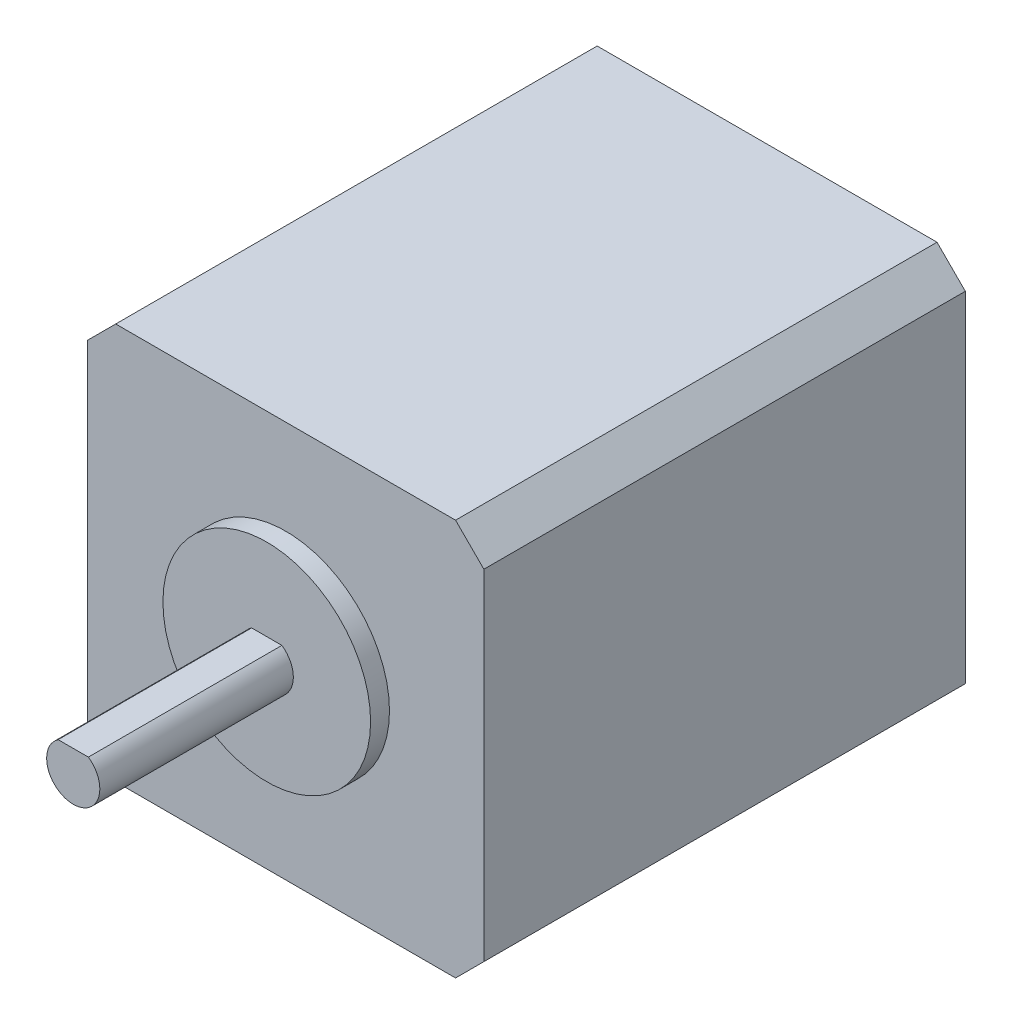
ISO-10303-21;
HEADER;
FILE_DESCRIPTION(('STEP AP214'),'2;1');
FILE_NAME('part.step','',(''),(''),'','','');
FILE_SCHEMA(('AUTOMOTIVE_DESIGN { 1 0 10303 214 1 1 1 1 }'));
ENDSEC;
DATA;
#1=APPLICATION_CONTEXT('core data for automotive mechanical design processes');
#2=APPLICATION_PROTOCOL_DEFINITION('international standard','automotive_design',2000,#1);
#3=PRODUCT_CONTEXT('',#1,'mechanical');
#4=PRODUCT('Part','Part','',(#3));
#5=PRODUCT_RELATED_PRODUCT_CATEGORY('part','',(#4));
#6=PRODUCT_DEFINITION_FORMATION('','',#4);
#7=PRODUCT_DEFINITION_CONTEXT('part definition',#1,'design');
#8=PRODUCT_DEFINITION('design','',#6,#7);
#9=PRODUCT_DEFINITION_SHAPE('','',#8);
#10=(LENGTH_UNIT() NAMED_UNIT(*) SI_UNIT(.MILLI.,.METRE.));
#11=(NAMED_UNIT(*) PLANE_ANGLE_UNIT() SI_UNIT($,.RADIAN.));
#12=(NAMED_UNIT(*) SI_UNIT($,.STERADIAN.) SOLID_ANGLE_UNIT());
#13=UNCERTAINTY_MEASURE_WITH_UNIT(LENGTH_MEASURE(1.E-05),#10,'distance_accuracy_value','');
#14=(GEOMETRIC_REPRESENTATION_CONTEXT(3) GLOBAL_UNCERTAINTY_ASSIGNED_CONTEXT((#13)) GLOBAL_UNIT_ASSIGNED_CONTEXT((#10,
#11,#12)) REPRESENTATION_CONTEXT('',''));
#15=CARTESIAN_POINT('',(0.,0.,0.));
#16=DIRECTION('',(0.,0.,1.));
#17=DIRECTION('',(1.,0.,0.));
#18=AXIS2_PLACEMENT_3D('',#15,#16,#17);
#19=CARTESIAN_POINT('',(21.,-21.,51.));
#20=DIRECTION('',(-1.,0.,0.));
#21=DIRECTION('',(0.,0.,1.));
#22=AXIS2_PLACEMENT_3D('',#19,#20,#21);
#23=PLANE('',#22);
#24=DIRECTION('',(0.,1.,0.));
#25=VECTOR('',#24,1.);
#26=CARTESIAN_POINT('',(21.,-21.,51.));
#27=LINE('',#26,#25);
#28=CARTESIAN_POINT('',(21.,-18.,51.));
#29=VERTEX_POINT('',#28);
#30=CARTESIAN_POINT('',(21.,18.,51.));
#31=VERTEX_POINT('',#30);
#32=EDGE_CURVE('E158',#29,#31,#27,.T.);
#33=ORIENTED_EDGE('',*,*,#32,.F.);
#34=DIRECTION('',(0.,0.,-1.));
#35=VECTOR('',#34,1.);
#36=CARTESIAN_POINT('',(21.,-18.,51.));
#37=LINE('',#36,#35);
#38=CARTESIAN_POINT('',(21.,-18.,0.));
#39=VERTEX_POINT('',#38);
#40=EDGE_CURVE('E178',#29,#39,#37,.T.);
#41=ORIENTED_EDGE('',*,*,#40,.T.);
#42=DIRECTION('',(0.,1.,0.));
#43=VECTOR('',#42,1.);
#44=CARTESIAN_POINT('',(21.,-21.,0.));
#45=LINE('',#44,#43);
#46=CARTESIAN_POINT('',(21.,18.,0.));
#47=VERTEX_POINT('',#46);
#48=EDGE_CURVE('E148',#39,#47,#45,.T.);
#49=ORIENTED_EDGE('',*,*,#48,.T.);
#50=DIRECTION('',(0.,0.,1.));
#51=VECTOR('',#50,1.);
#52=CARTESIAN_POINT('',(21.,18.,51.));
#53=LINE('',#52,#51);
#54=EDGE_CURVE('E156',#47,#31,#53,.T.);
#55=ORIENTED_EDGE('',*,*,#54,.T.);
#56=EDGE_LOOP('',(#33,#41,#49,#55));
#57=FACE_BOUND('',#56,.T.);
#58=ADVANCED_FACE('F47',(#57),#23,.F.);
#59=CARTESIAN_POINT('',(-21.,21.,51.));
#60=DIRECTION('',(0.,-1.,0.));
#61=DIRECTION('',(0.,0.,-1.));
#62=AXIS2_PLACEMENT_3D('',#59,#60,#61);
#63=PLANE('',#62);
#64=DIRECTION('',(-1.,0.,0.));
#65=VECTOR('',#64,1.);
#66=CARTESIAN_POINT('',(-21.,21.,0.));
#67=LINE('',#66,#65);
#68=CARTESIAN_POINT('',(18.,21.,0.));
#69=VERTEX_POINT('',#68);
#70=CARTESIAN_POINT('',(-18.,21.,0.));
#71=VERTEX_POINT('',#70);
#72=EDGE_CURVE('E170',#69,#71,#67,.T.);
#73=ORIENTED_EDGE('',*,*,#72,.T.);
#74=DIRECTION('',(0.,0.,1.));
#75=VECTOR('',#74,1.);
#76=CARTESIAN_POINT('',(-18.,21.,51.));
#77=LINE('',#76,#75);
#78=CARTESIAN_POINT('',(-18.,21.,51.));
#79=VERTEX_POINT('',#78);
#80=EDGE_CURVE('E11',#71,#79,#77,.T.);
#81=ORIENTED_EDGE('',*,*,#80,.T.);
#82=DIRECTION('',(-1.,0.,0.));
#83=VECTOR('',#82,1.);
#84=CARTESIAN_POINT('',(-21.,21.,51.));
#85=LINE('',#84,#83);
#86=CARTESIAN_POINT('',(18.,21.,51.));
#87=VERTEX_POINT('',#86);
#88=EDGE_CURVE('E161',#87,#79,#85,.T.);
#89=ORIENTED_EDGE('',*,*,#88,.F.);
#90=DIRECTION('',(0.,0.,-1.));
#91=VECTOR('',#90,1.);
#92=CARTESIAN_POINT('',(18.,21.,51.));
#93=LINE('',#92,#91);
#94=EDGE_CURVE('E56',#87,#69,#93,.T.);
#95=ORIENTED_EDGE('',*,*,#94,.T.);
#96=EDGE_LOOP('',(#73,#81,#89,#95));
#97=FACE_BOUND('',#96,.T.);
#98=ADVANCED_FACE('F209',(#97),#63,.F.);
#99=CARTESIAN_POINT('',(-21.,-21.,51.));
#100=DIRECTION('',(1.,0.,0.));
#101=DIRECTION('',(0.,0.,-1.));
#102=AXIS2_PLACEMENT_3D('',#99,#100,#101);
#103=PLANE('',#102);
#104=DIRECTION('',(0.,-1.,0.));
#105=VECTOR('',#104,1.);
#106=CARTESIAN_POINT('',(-21.,-21.,0.));
#107=LINE('',#106,#105);
#108=CARTESIAN_POINT('',(-21.,18.,0.));
#109=VERTEX_POINT('',#108);
#110=CARTESIAN_POINT('',(-21.,-18.,0.));
#111=VERTEX_POINT('',#110);
#112=EDGE_CURVE('E173',#109,#111,#107,.T.);
#113=ORIENTED_EDGE('',*,*,#112,.T.);
#114=DIRECTION('',(0.,0.,1.));
#115=VECTOR('',#114,1.);
#116=CARTESIAN_POINT('',(-21.,-18.,51.));
#117=LINE('',#116,#115);
#118=CARTESIAN_POINT('',(-21.,-18.,51.));
#119=VERTEX_POINT('',#118);
#120=EDGE_CURVE('E63',#111,#119,#117,.T.);
#121=ORIENTED_EDGE('',*,*,#120,.T.);
#122=DIRECTION('',(0.,-1.,0.));
#123=VECTOR('',#122,1.);
#124=CARTESIAN_POINT('',(-21.,-21.,51.));
#125=LINE('',#124,#123);
#126=CARTESIAN_POINT('',(-21.,18.,51.));
#127=VERTEX_POINT('',#126);
#128=EDGE_CURVE('E164',#127,#119,#125,.T.);
#129=ORIENTED_EDGE('',*,*,#128,.F.);
#130=DIRECTION('',(0.,0.,-1.));
#131=VECTOR('',#130,1.);
#132=CARTESIAN_POINT('',(-21.,18.,51.));
#133=LINE('',#132,#131);
#134=EDGE_CURVE('E201',#127,#109,#133,.T.);
#135=ORIENTED_EDGE('',*,*,#134,.T.);
#136=EDGE_LOOP('',(#113,#121,#129,#135));
#137=FACE_BOUND('',#136,.T.);
#138=ADVANCED_FACE('F220',(#137),#103,.F.);
#139=CARTESIAN_POINT('',(-21.,-21.,51.));
#140=DIRECTION('',(0.,1.,0.));
#141=DIRECTION('',(0.,0.,1.));
#142=AXIS2_PLACEMENT_3D('',#139,#140,#141);
#143=PLANE('',#142);
#144=DIRECTION('',(1.,0.,0.));
#145=VECTOR('',#144,1.);
#146=CARTESIAN_POINT('',(-21.,-21.,0.));
#147=LINE('',#146,#145);
#148=CARTESIAN_POINT('',(-18.,-21.,0.));
#149=VERTEX_POINT('',#148);
#150=CARTESIAN_POINT('',(18.,-21.,0.));
#151=VERTEX_POINT('',#150);
#152=EDGE_CURVE('E162',#149,#151,#147,.T.);
#153=ORIENTED_EDGE('',*,*,#152,.T.);
#154=DIRECTION('',(0.,0.,1.));
#155=VECTOR('',#154,1.);
#156=CARTESIAN_POINT('',(18.,-21.,51.));
#157=LINE('',#156,#155);
#158=CARTESIAN_POINT('',(18.,-21.,51.));
#159=VERTEX_POINT('',#158);
#160=EDGE_CURVE('E192',#151,#159,#157,.T.);
#161=ORIENTED_EDGE('',*,*,#160,.T.);
#162=DIRECTION('',(1.,0.,0.));
#163=VECTOR('',#162,1.);
#164=CARTESIAN_POINT('',(-21.,-21.,51.));
#165=LINE('',#164,#163);
#166=CARTESIAN_POINT('',(-18.,-21.,51.));
#167=VERTEX_POINT('',#166);
#168=EDGE_CURVE('E157',#167,#159,#165,.T.);
#169=ORIENTED_EDGE('',*,*,#168,.F.);
#170=DIRECTION('',(0.,0.,-1.));
#171=VECTOR('',#170,1.);
#172=CARTESIAN_POINT('',(-18.,-21.,51.));
#173=LINE('',#172,#171);
#174=EDGE_CURVE('E189',#167,#149,#173,.T.);
#175=ORIENTED_EDGE('',*,*,#174,.T.);
#176=EDGE_LOOP('',(#153,#161,#169,#175));
#177=FACE_BOUND('',#176,.T.);
#178=ADVANCED_FACE('F229',(#177),#143,.F.);
#179=CARTESIAN_POINT('',(0.,0.,51.));
#180=DIRECTION('',(0.,0.,-1.));
#181=DIRECTION('',(-1.,0.,0.));
#182=AXIS2_PLACEMENT_3D('',#179,#180,#181);
#183=PLANE('',#182);
#184=CARTESIAN_POINT('',(0.,0.,51.));
#185=DIRECTION('',(0.,0.,1.));
#186=DIRECTION('',(1.,0.,0.));
#187=AXIS2_PLACEMENT_3D('',#184,#185,#186);
#188=CIRCLE('',#187,11.);
#189=CARTESIAN_POINT('',(11.,0.,51.));
#190=VERTEX_POINT('',#189);
#191=EDGE_CURVE('E153',#190,#190,#188,.T.);
#192=ORIENTED_EDGE('',*,*,#191,.F.);
#193=EDGE_LOOP('',(#192));
#194=FACE_BOUND('',#193,.T.);
#195=ORIENTED_EDGE('',*,*,#168,.T.);
#196=DIRECTION('',(-0.707106781186549,-0.707106781186546,0.));
#197=VECTOR('',#196,1.);
#198=CARTESIAN_POINT('',(21.,-18.,51.));
#199=LINE('',#198,#197);
#200=EDGE_CURVE('E199',#159,#29,#199,.F.);
#201=ORIENTED_EDGE('',*,*,#200,.T.);
#202=ORIENTED_EDGE('',*,*,#32,.T.);
#203=DIRECTION('',(0.707106781186546,-0.707106781186549,0.));
#204=VECTOR('',#203,1.);
#205=CARTESIAN_POINT('',(18.,21.,51.));
#206=LINE('',#205,#204);
#207=EDGE_CURVE('E194',#31,#87,#206,.F.);
#208=ORIENTED_EDGE('',*,*,#207,.T.);
#209=ORIENTED_EDGE('',*,*,#88,.T.);
#210=DIRECTION('',(0.707106781186551,0.707106781186544,0.));
#211=VECTOR('',#210,1.);
#212=CARTESIAN_POINT('',(-21.,18.,51.));
#213=LINE('',#212,#211);
#214=EDGE_CURVE('E70',#79,#127,#213,.F.);
#215=ORIENTED_EDGE('',*,*,#214,.T.);
#216=ORIENTED_EDGE('',*,*,#128,.T.);
#217=DIRECTION('',(-0.707106781186544,0.707106781186551,0.));
#218=VECTOR('',#217,1.);
#219=CARTESIAN_POINT('',(-18.,-21.,51.));
#220=LINE('',#219,#218);
#221=EDGE_CURVE('E197',#119,#167,#220,.F.);
#222=ORIENTED_EDGE('',*,*,#221,.T.);
#223=EDGE_LOOP('',(#195,#201,#202,#208,#209,#215,#216,#222));
#224=FACE_BOUND('',#223,.T.);
#225=ADVANCED_FACE('F222',(#194,#224),#183,.F.);
#226=CARTESIAN_POINT('',(0.,0.,0.));
#227=DIRECTION('',(0.,0.,-1.));
#228=DIRECTION('',(-1.,0.,0.));
#229=AXIS2_PLACEMENT_3D('',#226,#227,#228);
#230=PLANE('',#229);
#231=ORIENTED_EDGE('',*,*,#48,.F.);
#232=DIRECTION('',(0.707106781186549,0.707106781186546,0.));
#233=VECTOR('',#232,1.);
#234=CARTESIAN_POINT('',(19.5,-19.5,0.));
#235=LINE('',#234,#233);
#236=EDGE_CURVE('E187',#39,#151,#235,.F.);
#237=ORIENTED_EDGE('',*,*,#236,.T.);
#238=ORIENTED_EDGE('',*,*,#152,.F.);
#239=DIRECTION('',(0.707106781186544,-0.707106781186551,0.));
#240=VECTOR('',#239,1.);
#241=CARTESIAN_POINT('',(-19.5000000000001,-19.4999999999999,0.));
#242=LINE('',#241,#240);
#243=EDGE_CURVE('E185',#149,#111,#242,.F.);
#244=ORIENTED_EDGE('',*,*,#243,.T.);
#245=ORIENTED_EDGE('',*,*,#112,.F.);
#246=DIRECTION('',(-0.707106781186551,-0.707106781186544,0.));
#247=VECTOR('',#246,1.);
#248=CARTESIAN_POINT('',(-19.4999999999999,19.5000000000001,0.));
#249=LINE('',#248,#247);
#250=EDGE_CURVE('E183',#109,#71,#249,.F.);
#251=ORIENTED_EDGE('',*,*,#250,.T.);
#252=ORIENTED_EDGE('',*,*,#72,.F.);
#253=DIRECTION('',(-0.707106781186546,0.707106781186549,0.));
#254=VECTOR('',#253,1.);
#255=CARTESIAN_POINT('',(19.5,19.5,0.));
#256=LINE('',#255,#254);
#257=EDGE_CURVE('E181',#69,#47,#256,.F.);
#258=ORIENTED_EDGE('',*,*,#257,.T.);
#259=EDGE_LOOP('',(#231,#237,#238,#244,#245,#251,#252,#258));
#260=FACE_BOUND('',#259,.T.);
#261=ADVANCED_FACE('F215',(#260),#230,.T.);
#262=CARTESIAN_POINT('',(0.,0.,53.));
#263=DIRECTION('',(0.,0.,-1.));
#264=DIRECTION('',(-1.,0.,0.));
#265=AXIS2_PLACEMENT_3D('',#262,#263,#264);
#266=CYLINDRICAL_SURFACE('',#265,11.);
#267=CARTESIAN_POINT('',(0.,0.,53.));
#268=DIRECTION('',(0.,0.,1.));
#269=DIRECTION('',(1.,0.,0.));
#270=AXIS2_PLACEMENT_3D('',#267,#268,#269);
#271=CIRCLE('',#270,11.);
#272=CARTESIAN_POINT('',(11.,0.,53.));
#273=VERTEX_POINT('',#272);
#274=EDGE_CURVE('E145',#273,#273,#271,.T.);
#275=ORIENTED_EDGE('',*,*,#274,.F.);
#276=EDGE_LOOP('',(#275));
#277=FACE_BOUND('',#276,.T.);
#278=ORIENTED_EDGE('',*,*,#191,.T.);
#279=EDGE_LOOP('',(#278));
#280=FACE_BOUND('',#279,.T.);
#281=ADVANCED_FACE('F341',(#277,#280),#266,.T.);
#282=CARTESIAN_POINT('',(0.,0.,53.));
#283=DIRECTION('',(0.,0.,1.));
#284=DIRECTION('',(1.,0.,0.));
#285=AXIS2_PLACEMENT_3D('',#282,#283,#284);
#286=PLANE('',#285);
#287=CARTESIAN_POINT('',(0.,0.,53.));
#288=DIRECTION('',(0.,0.,1.));
#289=DIRECTION('',(1.,0.,0.));
#290=AXIS2_PLACEMENT_3D('',#287,#288,#289);
#291=CIRCLE('',#290,2.81584852769556);
#292=CARTESIAN_POINT('',(-1.60182662223337,2.31584852769556,53.));
#293=VERTEX_POINT('',#292);
#294=CARTESIAN_POINT('',(1.60182662223337,2.31584852769556,53.));
#295=VERTEX_POINT('',#294);
#296=EDGE_CURVE('E144',#293,#295,#291,.T.);
#297=ORIENTED_EDGE('',*,*,#296,.F.);
#298=DIRECTION('',(-1.,0.,0.));
#299=VECTOR('',#298,1.);
#300=CARTESIAN_POINT('',(-1.60182662223337,2.31584852769556,53.));
#301=LINE('',#300,#299);
#302=EDGE_CURVE('E141',#295,#293,#301,.T.);
#303=ORIENTED_EDGE('',*,*,#302,.F.);
#304=EDGE_LOOP('',(#297,#303));
#305=FACE_BOUND('',#304,.T.);
#306=ORIENTED_EDGE('',*,*,#274,.T.);
#307=EDGE_LOOP('',(#306));
#308=FACE_BOUND('',#307,.T.);
#309=ADVANCED_FACE('F330',(#305,#308),#286,.T.);
#310=CARTESIAN_POINT('',(0.,0.,73.5));
#311=DIRECTION('',(0.,0.,-1.));
#312=DIRECTION('',(-1.,0.,0.));
#313=AXIS2_PLACEMENT_3D('',#310,#311,#312);
#314=CYLINDRICAL_SURFACE('',#313,2.81584852769556);
#315=ORIENTED_EDGE('',*,*,#296,.T.);
#316=DIRECTION('',(0.,0.,-1.));
#317=VECTOR('',#316,1.);
#318=CARTESIAN_POINT('',(1.60182662223337,2.31584852769556,73.5));
#319=LINE('',#318,#317);
#320=CARTESIAN_POINT('',(1.60182662223337,2.31584852769556,73.5));
#321=VERTEX_POINT('',#320);
#322=EDGE_CURVE('E131',#321,#295,#319,.T.);
#323=ORIENTED_EDGE('',*,*,#322,.F.);
#324=CARTESIAN_POINT('',(0.,0.,73.5));
#325=DIRECTION('',(0.,0.,1.));
#326=DIRECTION('',(1.,0.,0.));
#327=AXIS2_PLACEMENT_3D('',#324,#325,#326);
#328=CIRCLE('',#327,2.81584852769556);
#329=CARTESIAN_POINT('',(-1.60182662223337,2.31584852769556,73.5));
#330=VERTEX_POINT('',#329);
#331=EDGE_CURVE('E137',#330,#321,#328,.T.);
#332=ORIENTED_EDGE('',*,*,#331,.F.);
#333=DIRECTION('',(0.,0.,-1.));
#334=VECTOR('',#333,1.);
#335=CARTESIAN_POINT('',(-1.60182662223337,2.31584852769556,73.5));
#336=LINE('',#335,#334);
#337=EDGE_CURVE('E134',#330,#293,#336,.T.);
#338=ORIENTED_EDGE('',*,*,#337,.T.);
#339=EDGE_LOOP('',(#315,#323,#332,#338));
#340=FACE_BOUND('',#339,.T.);
#341=ADVANCED_FACE('F143',(#340),#314,.T.);
#342=CARTESIAN_POINT('',(-1.60182662223337,2.31584852769556,73.5));
#343=DIRECTION('',(0.,-1.,0.));
#344=DIRECTION('',(0.,0.,-1.));
#345=AXIS2_PLACEMENT_3D('',#342,#343,#344);
#346=PLANE('',#345);
#347=ORIENTED_EDGE('',*,*,#302,.T.);
#348=ORIENTED_EDGE('',*,*,#337,.F.);
#349=DIRECTION('',(-1.,0.,0.));
#350=VECTOR('',#349,1.);
#351=CARTESIAN_POINT('',(-1.60182662223337,2.31584852769556,73.5));
#352=LINE('',#351,#350);
#353=EDGE_CURVE('E126',#321,#330,#352,.T.);
#354=ORIENTED_EDGE('',*,*,#353,.F.);
#355=ORIENTED_EDGE('',*,*,#322,.T.);
#356=EDGE_LOOP('',(#347,#348,#354,#355));
#357=FACE_BOUND('',#356,.T.);
#358=ADVANCED_FACE('F129',(#357),#346,.F.);
#359=CARTESIAN_POINT('',(0.,0.,73.5));
#360=DIRECTION('',(0.,0.,1.));
#361=DIRECTION('',(1.,0.,0.));
#362=AXIS2_PLACEMENT_3D('',#359,#360,#361);
#363=PLANE('',#362);
#364=ORIENTED_EDGE('',*,*,#331,.T.);
#365=ORIENTED_EDGE('',*,*,#353,.T.);
#366=EDGE_LOOP('',(#364,#365));
#367=FACE_BOUND('',#366,.T.);
#368=ADVANCED_FACE('F139',(#367),#363,.T.);
#369=CARTESIAN_POINT('',(21.,-18.,51.));
#370=DIRECTION('',(-0.707106781186546,0.707106781186549,0.));
#371=DIRECTION('',(0.,0.,-1.));
#372=AXIS2_PLACEMENT_3D('',#369,#370,#371);
#373=PLANE('',#372);
#374=ORIENTED_EDGE('',*,*,#200,.F.);
#375=ORIENTED_EDGE('',*,*,#160,.F.);
#376=ORIENTED_EDGE('',*,*,#236,.F.);
#377=ORIENTED_EDGE('',*,*,#40,.F.);
#378=EDGE_LOOP('',(#374,#375,#376,#377));
#379=FACE_BOUND('',#378,.T.);
#380=ADVANCED_FACE('F234',(#379),#373,.F.);
#381=CARTESIAN_POINT('',(-18.,-21.,51.));
#382=DIRECTION('',(0.707106781186551,0.707106781186544,0.));
#383=DIRECTION('',(0.,0.,-1.));
#384=AXIS2_PLACEMENT_3D('',#381,#382,#383);
#385=PLANE('',#384);
#386=ORIENTED_EDGE('',*,*,#221,.F.);
#387=ORIENTED_EDGE('',*,*,#120,.F.);
#388=ORIENTED_EDGE('',*,*,#243,.F.);
#389=ORIENTED_EDGE('',*,*,#174,.F.);
#390=EDGE_LOOP('',(#386,#387,#388,#389));
#391=FACE_BOUND('',#390,.T.);
#392=ADVANCED_FACE('F226',(#391),#385,.F.);
#393=CARTESIAN_POINT('',(-21.,18.,51.));
#394=DIRECTION('',(0.707106781186544,-0.707106781186551,0.));
#395=DIRECTION('',(0.,0.,-1.));
#396=AXIS2_PLACEMENT_3D('',#393,#394,#395);
#397=PLANE('',#396);
#398=ORIENTED_EDGE('',*,*,#214,.F.);
#399=ORIENTED_EDGE('',*,*,#80,.F.);
#400=ORIENTED_EDGE('',*,*,#250,.F.);
#401=ORIENTED_EDGE('',*,*,#134,.F.);
#402=EDGE_LOOP('',(#398,#399,#400,#401));
#403=FACE_BOUND('',#402,.T.);
#404=ADVANCED_FACE('F219',(#403),#397,.F.);
#405=CARTESIAN_POINT('',(18.,21.,51.));
#406=DIRECTION('',(-0.707106781186549,-0.707106781186546,0.));
#407=DIRECTION('',(0.,0.,-1.));
#408=AXIS2_PLACEMENT_3D('',#405,#406,#407);
#409=PLANE('',#408);
#410=ORIENTED_EDGE('',*,*,#207,.F.);
#411=ORIENTED_EDGE('',*,*,#54,.F.);
#412=ORIENTED_EDGE('',*,*,#257,.F.);
#413=ORIENTED_EDGE('',*,*,#94,.F.);
#414=EDGE_LOOP('',(#410,#411,#412,#413));
#415=FACE_BOUND('',#414,.T.);
#416=ADVANCED_FACE('F50',(#415),#409,.F.);
#417=CLOSED_SHELL('',(#58,#98,#138,#178,#225,#261,#281,#309,#341,#358,#368,#380,#392,#404,#416));
#418=MANIFOLD_SOLID_BREP('B2',#417);
#419=ADVANCED_BREP_SHAPE_REPRESENTATION('',(#18,#418),#14);
#420=SHAPE_DEFINITION_REPRESENTATION(#9,#419);
ENDSEC;
END-ISO-10303-21;
